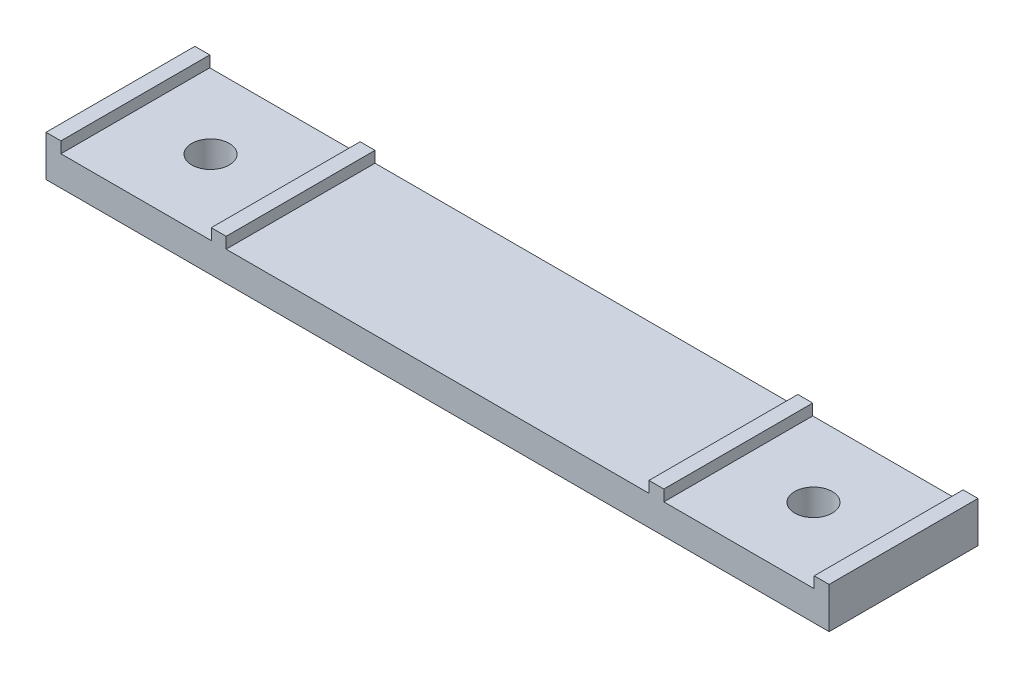
ISO-10303-21;
HEADER;
FILE_DESCRIPTION(('STEP AP214'),'2;1');
FILE_NAME('part.step','',(''),(''),'','','');
FILE_SCHEMA(('AUTOMOTIVE_DESIGN { 1 0 10303 214 1 1 1 1 }'));
ENDSEC;
DATA;
#1=APPLICATION_CONTEXT('core data for automotive mechanical design processes');
#2=APPLICATION_PROTOCOL_DEFINITION('international standard','automotive_design',2000,#1);
#3=PRODUCT_CONTEXT('',#1,'mechanical');
#4=PRODUCT('Part','Part','',(#3));
#5=PRODUCT_RELATED_PRODUCT_CATEGORY('part','',(#4));
#6=PRODUCT_DEFINITION_FORMATION('','',#4);
#7=PRODUCT_DEFINITION_CONTEXT('part definition',#1,'design');
#8=PRODUCT_DEFINITION('design','',#6,#7);
#9=PRODUCT_DEFINITION_SHAPE('','',#8);
#10=(LENGTH_UNIT() NAMED_UNIT(*) SI_UNIT(.MILLI.,.METRE.));
#11=(NAMED_UNIT(*) PLANE_ANGLE_UNIT() SI_UNIT($,.RADIAN.));
#12=(NAMED_UNIT(*) SI_UNIT($,.STERADIAN.) SOLID_ANGLE_UNIT());
#13=UNCERTAINTY_MEASURE_WITH_UNIT(LENGTH_MEASURE(1.E-05),#10,'distance_accuracy_value','');
#14=(GEOMETRIC_REPRESENTATION_CONTEXT(3) GLOBAL_UNCERTAINTY_ASSIGNED_CONTEXT((#13)) GLOBAL_UNIT_ASSIGNED_CONTEXT((#10,
#11,#12)) REPRESENTATION_CONTEXT('',''));
#15=CARTESIAN_POINT('',(0.,0.,0.));
#16=DIRECTION('',(0.,0.,1.));
#17=DIRECTION('',(1.,0.,0.));
#18=AXIS2_PLACEMENT_3D('',#15,#16,#17);
#19=CARTESIAN_POINT('',(-64.262,5.07999999999999,25.4));
#20=DIRECTION('',(0.,-1.,0.));
#21=DIRECTION('',(1.,0.,0.));
#22=AXIS2_PLACEMENT_3D('',#19,#20,#21);
#23=PLANE('',#22);
#24=CARTESIAN_POINT('',(-51.435,5.08,12.7));
#25=DIRECTION('',(0.,1.,0.));
#26=DIRECTION('',(0.,0.,1.));
#27=AXIS2_PLACEMENT_3D('',#24,#25,#26);
#28=CIRCLE('',#27,3.2004);
#29=CARTESIAN_POINT('',(-51.435,5.08,15.9004));
#30=VERTEX_POINT('',#29);
#31=EDGE_CURVE('E374',#30,#30,#28,.T.);
#32=ORIENTED_EDGE('',*,*,#31,.F.);
#33=EDGE_LOOP('',(#32));
#34=FACE_BOUND('',#33,.T.);
#35=DIRECTION('',(-1.,0.,0.));
#36=VECTOR('',#35,1.);
#37=CARTESIAN_POINT('',(-64.262,5.07999999999999,0.));
#38=LINE('',#37,#36);
#39=CARTESIAN_POINT('',(-38.608,5.08,0.));
#40=VERTEX_POINT('',#39);
#41=CARTESIAN_POINT('',(-64.262,5.07999999999999,0.));
#42=VERTEX_POINT('',#41);
#43=EDGE_CURVE('E193',#40,#42,#38,.T.);
#44=ORIENTED_EDGE('',*,*,#43,.T.);
#45=DIRECTION('',(0.,0.,-1.));
#46=VECTOR('',#45,1.);
#47=CARTESIAN_POINT('',(-64.262,5.07999999999999,25.4));
#48=LINE('',#47,#46);
#49=CARTESIAN_POINT('',(-64.262,5.07999999999999,25.4));
#50=VERTEX_POINT('',#49);
#51=EDGE_CURVE('E11',#50,#42,#48,.T.);
#52=ORIENTED_EDGE('',*,*,#51,.F.);
#53=DIRECTION('',(-1.,0.,0.));
#54=VECTOR('',#53,1.);
#55=CARTESIAN_POINT('',(-64.262,5.07999999999999,25.4));
#56=LINE('',#55,#54);
#57=CARTESIAN_POINT('',(-38.608,5.08,25.4));
#58=VERTEX_POINT('',#57);
#59=EDGE_CURVE('E242',#58,#50,#56,.T.);
#60=ORIENTED_EDGE('',*,*,#59,.F.);
#61=DIRECTION('',(0.,0.,-1.));
#62=VECTOR('',#61,1.);
#63=CARTESIAN_POINT('',(-38.608,5.08,25.4));
#64=LINE('',#63,#62);
#65=EDGE_CURVE('E192',#58,#40,#64,.T.);
#66=ORIENTED_EDGE('',*,*,#65,.T.);
#67=EDGE_LOOP('',(#44,#52,#60,#66));
#68=FACE_BOUND('',#67,.T.);
#69=ADVANCED_FACE('F44',(#34,#68),#23,.F.);
#70=CARTESIAN_POINT('',(-64.262,6.98499999999999,25.4));
#71=DIRECTION('',(-1.,0.,0.));
#72=DIRECTION('',(0.,0.,1.));
#73=AXIS2_PLACEMENT_3D('',#70,#71,#72);
#74=PLANE('',#73);
#75=DIRECTION('',(0.,1.,0.));
#76=VECTOR('',#75,1.);
#77=CARTESIAN_POINT('',(-64.262,6.98499999999999,0.));
#78=LINE('',#77,#76);
#79=CARTESIAN_POINT('',(-64.262,6.98499999999999,0.));
#80=VERTEX_POINT('',#79);
#81=EDGE_CURVE('E199',#42,#80,#78,.T.);
#82=ORIENTED_EDGE('',*,*,#81,.T.);
#83=DIRECTION('',(0.,0.,-1.));
#84=VECTOR('',#83,1.);
#85=CARTESIAN_POINT('',(-64.262,6.98499999999999,25.4));
#86=LINE('',#85,#84);
#87=CARTESIAN_POINT('',(-64.262,6.98499999999999,25.4));
#88=VERTEX_POINT('',#87);
#89=EDGE_CURVE('E54',#88,#80,#86,.T.);
#90=ORIENTED_EDGE('',*,*,#89,.F.);
#91=DIRECTION('',(0.,1.,0.));
#92=VECTOR('',#91,1.);
#93=CARTESIAN_POINT('',(-64.262,6.98499999999999,25.4));
#94=LINE('',#93,#92);
#95=EDGE_CURVE('E127',#50,#88,#94,.T.);
#96=ORIENTED_EDGE('',*,*,#95,.F.);
#97=ORIENTED_EDGE('',*,*,#51,.T.);
#98=EDGE_LOOP('',(#82,#90,#96,#97));
#99=FACE_BOUND('',#98,.T.);
#100=ADVANCED_FACE('F362',(#99),#74,.F.);
#101=CARTESIAN_POINT('',(-66.802,6.98499999999999,25.4));
#102=DIRECTION('',(0.,-1.,0.));
#103=DIRECTION('',(1.,0.,0.));
#104=AXIS2_PLACEMENT_3D('',#101,#102,#103);
#105=PLANE('',#104);
#106=DIRECTION('',(-1.,0.,0.));
#107=VECTOR('',#106,1.);
#108=CARTESIAN_POINT('',(-66.802,6.98499999999999,0.));
#109=LINE('',#108,#107);
#110=CARTESIAN_POINT('',(-66.802,6.98499999999999,0.));
#111=VERTEX_POINT('',#110);
#112=EDGE_CURVE('E205',#80,#111,#109,.T.);
#113=ORIENTED_EDGE('',*,*,#112,.T.);
#114=DIRECTION('',(0.,0.,-1.));
#115=VECTOR('',#114,1.);
#116=CARTESIAN_POINT('',(-66.802,6.98499999999999,25.4));
#117=LINE('',#116,#115);
#118=CARTESIAN_POINT('',(-66.802,6.98499999999999,25.4));
#119=VERTEX_POINT('',#118);
#120=EDGE_CURVE('E281',#119,#111,#117,.T.);
#121=ORIENTED_EDGE('',*,*,#120,.F.);
#122=DIRECTION('',(-1.,0.,0.));
#123=VECTOR('',#122,1.);
#124=CARTESIAN_POINT('',(-66.802,6.98499999999999,25.4));
#125=LINE('',#124,#123);
#126=EDGE_CURVE('E293',#88,#119,#125,.T.);
#127=ORIENTED_EDGE('',*,*,#126,.F.);
#128=ORIENTED_EDGE('',*,*,#89,.T.);
#129=EDGE_LOOP('',(#113,#121,#127,#128));
#130=FACE_BOUND('',#129,.T.);
#131=ADVANCED_FACE('F291',(#130),#105,.F.);
#132=CARTESIAN_POINT('',(-66.802,0.,25.4));
#133=DIRECTION('',(1.,0.,0.));
#134=DIRECTION('',(0.,0.,-1.));
#135=AXIS2_PLACEMENT_3D('',#132,#133,#134);
#136=PLANE('',#135);
#137=DIRECTION('',(0.,-1.,0.));
#138=VECTOR('',#137,1.);
#139=CARTESIAN_POINT('',(-66.802,0.,0.));
#140=LINE('',#139,#138);
#141=CARTESIAN_POINT('',(-66.802,0.,0.));
#142=VERTEX_POINT('',#141);
#143=EDGE_CURVE('E203',#111,#142,#140,.T.);
#144=ORIENTED_EDGE('',*,*,#143,.T.);
#145=DIRECTION('',(0.,0.,-1.));
#146=VECTOR('',#145,1.);
#147=CARTESIAN_POINT('',(-66.802,0.,25.4));
#148=LINE('',#147,#146);
#149=CARTESIAN_POINT('',(-66.802,0.,25.4));
#150=VERTEX_POINT('',#149);
#151=EDGE_CURVE('E279',#150,#142,#148,.T.);
#152=ORIENTED_EDGE('',*,*,#151,.F.);
#153=DIRECTION('',(0.,-1.,0.));
#154=VECTOR('',#153,1.);
#155=CARTESIAN_POINT('',(-66.802,0.,25.4));
#156=LINE('',#155,#154);
#157=EDGE_CURVE('E312',#119,#150,#156,.T.);
#158=ORIENTED_EDGE('',*,*,#157,.F.);
#159=ORIENTED_EDGE('',*,*,#120,.T.);
#160=EDGE_LOOP('',(#144,#152,#158,#159));
#161=FACE_BOUND('',#160,.T.);
#162=ADVANCED_FACE('F305',(#161),#136,.F.);
#163=CARTESIAN_POINT('',(66.802,0.,25.4));
#164=DIRECTION('',(0.,1.,0.));
#165=DIRECTION('',(0.,0.,1.));
#166=AXIS2_PLACEMENT_3D('',#163,#164,#165);
#167=PLANE('',#166);
#168=CARTESIAN_POINT('',(-51.435,0.,12.7));
#169=DIRECTION('',(0.,1.,0.));
#170=DIRECTION('',(0.,0.,1.));
#171=AXIS2_PLACEMENT_3D('',#168,#169,#170);
#172=CIRCLE('',#171,3.2004);
#173=CARTESIAN_POINT('',(-51.435,0.,15.9004));
#174=VERTEX_POINT('',#173);
#175=EDGE_CURVE('E48',#174,#174,#172,.T.);
#176=ORIENTED_EDGE('',*,*,#175,.T.);
#177=EDGE_LOOP('',(#176));
#178=FACE_BOUND('',#177,.T.);
#179=CARTESIAN_POINT('',(51.435,0.,12.7));
#180=DIRECTION('',(0.,1.,0.));
#181=DIRECTION('',(0.,0.,1.));
#182=AXIS2_PLACEMENT_3D('',#179,#180,#181);
#183=CIRCLE('',#182,3.2004);
#184=CARTESIAN_POINT('',(51.435,0.,15.9004));
#185=VERTEX_POINT('',#184);
#186=EDGE_CURVE('E377',#185,#185,#183,.T.);
#187=ORIENTED_EDGE('',*,*,#186,.T.);
#188=EDGE_LOOP('',(#187));
#189=FACE_BOUND('',#188,.T.);
#190=DIRECTION('',(1.,0.,0.));
#191=VECTOR('',#190,1.);
#192=CARTESIAN_POINT('',(66.802,0.,0.));
#193=LINE('',#192,#191);
#194=CARTESIAN_POINT('',(66.802,0.,0.));
#195=VERTEX_POINT('',#194);
#196=EDGE_CURVE('E208',#142,#195,#193,.T.);
#197=ORIENTED_EDGE('',*,*,#196,.T.);
#198=DIRECTION('',(0.,0.,-1.));
#199=VECTOR('',#198,1.);
#200=CARTESIAN_POINT('',(66.802,0.,25.4));
#201=LINE('',#200,#199);
#202=CARTESIAN_POINT('',(66.802,0.,25.4));
#203=VERTEX_POINT('',#202);
#204=EDGE_CURVE('E276',#203,#195,#201,.T.);
#205=ORIENTED_EDGE('',*,*,#204,.F.);
#206=DIRECTION('',(1.,0.,0.));
#207=VECTOR('',#206,1.);
#208=CARTESIAN_POINT('',(66.802,0.,25.4));
#209=LINE('',#208,#207);
#210=EDGE_CURVE('E307',#150,#203,#209,.T.);
#211=ORIENTED_EDGE('',*,*,#210,.F.);
#212=ORIENTED_EDGE('',*,*,#151,.T.);
#213=EDGE_LOOP('',(#197,#205,#211,#212));
#214=FACE_BOUND('',#213,.T.);
#215=ADVANCED_FACE('F306',(#178,#189,#214),#167,.F.);
#216=CARTESIAN_POINT('',(66.802,0.,25.4));
#217=DIRECTION('',(-1.,0.,0.));
#218=DIRECTION('',(0.,0.,1.));
#219=AXIS2_PLACEMENT_3D('',#216,#217,#218);
#220=PLANE('',#219);
#221=DIRECTION('',(0.,1.,0.));
#222=VECTOR('',#221,1.);
#223=CARTESIAN_POINT('',(66.802,0.,0.));
#224=LINE('',#223,#222);
#225=CARTESIAN_POINT('',(66.802,6.98499999999999,0.));
#226=VERTEX_POINT('',#225);
#227=EDGE_CURVE('E213',#195,#226,#224,.T.);
#228=ORIENTED_EDGE('',*,*,#227,.T.);
#229=DIRECTION('',(0.,0.,-1.));
#230=VECTOR('',#229,1.);
#231=CARTESIAN_POINT('',(66.802,6.98499999999999,25.4));
#232=LINE('',#231,#230);
#233=CARTESIAN_POINT('',(66.802,6.98499999999999,25.4));
#234=VERTEX_POINT('',#233);
#235=EDGE_CURVE('E275',#234,#226,#232,.T.);
#236=ORIENTED_EDGE('',*,*,#235,.F.);
#237=DIRECTION('',(0.,1.,0.));
#238=VECTOR('',#237,1.);
#239=CARTESIAN_POINT('',(66.802,0.,25.4));
#240=LINE('',#239,#238);
#241=EDGE_CURVE('E313',#203,#234,#240,.T.);
#242=ORIENTED_EDGE('',*,*,#241,.F.);
#243=ORIENTED_EDGE('',*,*,#204,.T.);
#244=EDGE_LOOP('',(#228,#236,#242,#243));
#245=FACE_BOUND('',#244,.T.);
#246=ADVANCED_FACE('F498',(#245),#220,.F.);
#247=CARTESIAN_POINT('',(66.802,6.98499999999999,25.4));
#248=DIRECTION('',(0.,-1.,0.));
#249=DIRECTION('',(1.,0.,0.));
#250=AXIS2_PLACEMENT_3D('',#247,#248,#249);
#251=PLANE('',#250);
#252=DIRECTION('',(-1.,0.,0.));
#253=VECTOR('',#252,1.);
#254=CARTESIAN_POINT('',(66.802,6.98499999999999,0.));
#255=LINE('',#254,#253);
#256=CARTESIAN_POINT('',(64.262,6.98499999999999,0.));
#257=VERTEX_POINT('',#256);
#258=EDGE_CURVE('E215',#226,#257,#255,.T.);
#259=ORIENTED_EDGE('',*,*,#258,.T.);
#260=DIRECTION('',(0.,0.,-1.));
#261=VECTOR('',#260,1.);
#262=CARTESIAN_POINT('',(64.262,6.98499999999999,25.4));
#263=LINE('',#262,#261);
#264=CARTESIAN_POINT('',(64.262,6.98499999999999,25.4));
#265=VERTEX_POINT('',#264);
#266=EDGE_CURVE('E268',#265,#257,#263,.T.);
#267=ORIENTED_EDGE('',*,*,#266,.F.);
#268=DIRECTION('',(-1.,0.,0.));
#269=VECTOR('',#268,1.);
#270=CARTESIAN_POINT('',(66.802,6.98499999999999,25.4));
#271=LINE('',#270,#269);
#272=EDGE_CURVE('E318',#234,#265,#271,.T.);
#273=ORIENTED_EDGE('',*,*,#272,.F.);
#274=ORIENTED_EDGE('',*,*,#235,.T.);
#275=EDGE_LOOP('',(#259,#267,#273,#274));
#276=FACE_BOUND('',#275,.T.);
#277=ADVANCED_FACE('F486',(#276),#251,.F.);
#278=CARTESIAN_POINT('',(64.262,6.98499999999999,25.4));
#279=DIRECTION('',(1.,0.,0.));
#280=DIRECTION('',(0.,0.,-1.));
#281=AXIS2_PLACEMENT_3D('',#278,#279,#280);
#282=PLANE('',#281);
#283=DIRECTION('',(0.,-1.,0.));
#284=VECTOR('',#283,1.);
#285=CARTESIAN_POINT('',(64.262,6.98499999999999,0.));
#286=LINE('',#285,#284);
#287=CARTESIAN_POINT('',(64.262,5.07999999999999,0.));
#288=VERTEX_POINT('',#287);
#289=EDGE_CURVE('E220',#257,#288,#286,.T.);
#290=ORIENTED_EDGE('',*,*,#289,.T.);
#291=DIRECTION('',(0.,0.,-1.));
#292=VECTOR('',#291,1.);
#293=CARTESIAN_POINT('',(64.262,5.07999999999999,25.4));
#294=LINE('',#293,#292);
#295=CARTESIAN_POINT('',(64.262,5.07999999999999,25.4));
#296=VERTEX_POINT('',#295);
#297=EDGE_CURVE('E264',#296,#288,#294,.T.);
#298=ORIENTED_EDGE('',*,*,#297,.F.);
#299=DIRECTION('',(0.,-1.,0.));
#300=VECTOR('',#299,1.);
#301=CARTESIAN_POINT('',(64.262,6.98499999999999,25.4));
#302=LINE('',#301,#300);
#303=EDGE_CURVE('E324',#265,#296,#302,.T.);
#304=ORIENTED_EDGE('',*,*,#303,.F.);
#305=ORIENTED_EDGE('',*,*,#266,.T.);
#306=EDGE_LOOP('',(#290,#298,#304,#305));
#307=FACE_BOUND('',#306,.T.);
#308=ADVANCED_FACE('F479',(#307),#282,.F.);
#309=CARTESIAN_POINT('',(64.262,5.07999999999999,25.4));
#310=DIRECTION('',(0.,-1.,0.));
#311=DIRECTION('',(1.,0.,0.));
#312=AXIS2_PLACEMENT_3D('',#309,#310,#311);
#313=PLANE('',#312);
#314=CARTESIAN_POINT('',(51.435,5.08,12.7));
#315=DIRECTION('',(0.,1.,0.));
#316=DIRECTION('',(0.,0.,1.));
#317=AXIS2_PLACEMENT_3D('',#314,#315,#316);
#318=CIRCLE('',#317,3.2004);
#319=CARTESIAN_POINT('',(51.435,5.08,15.9004));
#320=VERTEX_POINT('',#319);
#321=EDGE_CURVE('E380',#320,#320,#318,.T.);
#322=ORIENTED_EDGE('',*,*,#321,.F.);
#323=EDGE_LOOP('',(#322));
#324=FACE_BOUND('',#323,.T.);
#325=DIRECTION('',(-1.,0.,0.));
#326=VECTOR('',#325,1.);
#327=CARTESIAN_POINT('',(64.262,5.07999999999999,0.));
#328=LINE('',#327,#326);
#329=CARTESIAN_POINT('',(38.608,5.08,0.));
#330=VERTEX_POINT('',#329);
#331=EDGE_CURVE('E217',#288,#330,#328,.T.);
#332=ORIENTED_EDGE('',*,*,#331,.T.);
#333=DIRECTION('',(0.,0.,-1.));
#334=VECTOR('',#333,1.);
#335=CARTESIAN_POINT('',(38.608,5.08,25.4));
#336=LINE('',#335,#334);
#337=CARTESIAN_POINT('',(38.608,5.08,25.4));
#338=VERTEX_POINT('',#337);
#339=EDGE_CURVE('E259',#338,#330,#336,.T.);
#340=ORIENTED_EDGE('',*,*,#339,.F.);
#341=DIRECTION('',(-1.,0.,0.));
#342=VECTOR('',#341,1.);
#343=CARTESIAN_POINT('',(64.262,5.07999999999999,25.4));
#344=LINE('',#343,#342);
#345=EDGE_CURVE('E329',#296,#338,#344,.T.);
#346=ORIENTED_EDGE('',*,*,#345,.F.);
#347=ORIENTED_EDGE('',*,*,#297,.T.);
#348=EDGE_LOOP('',(#332,#340,#346,#347));
#349=FACE_BOUND('',#348,.T.);
#350=ADVANCED_FACE('F468',(#324,#349),#313,.F.);
#351=CARTESIAN_POINT('',(38.608,5.08,25.4));
#352=DIRECTION('',(-1.,0.,0.));
#353=DIRECTION('',(0.,-1.,0.));
#354=AXIS2_PLACEMENT_3D('',#351,#352,#353);
#355=PLANE('',#354);
#356=DIRECTION('',(0.,1.,0.));
#357=VECTOR('',#356,1.);
#358=CARTESIAN_POINT('',(38.608,5.08,0.));
#359=LINE('',#358,#357);
#360=CARTESIAN_POINT('',(38.608,6.985,0.));
#361=VERTEX_POINT('',#360);
#362=EDGE_CURVE('E223',#330,#361,#359,.T.);
#363=ORIENTED_EDGE('',*,*,#362,.T.);
#364=DIRECTION('',(0.,0.,-1.));
#365=VECTOR('',#364,1.);
#366=CARTESIAN_POINT('',(38.608,6.985,25.4));
#367=LINE('',#366,#365);
#368=CARTESIAN_POINT('',(38.608,6.985,25.4));
#369=VERTEX_POINT('',#368);
#370=EDGE_CURVE('E258',#369,#361,#367,.T.);
#371=ORIENTED_EDGE('',*,*,#370,.F.);
#372=DIRECTION('',(0.,1.,0.));
#373=VECTOR('',#372,1.);
#374=CARTESIAN_POINT('',(38.608,5.08,25.4));
#375=LINE('',#374,#373);
#376=EDGE_CURVE('E332',#338,#369,#375,.T.);
#377=ORIENTED_EDGE('',*,*,#376,.F.);
#378=ORIENTED_EDGE('',*,*,#339,.T.);
#379=EDGE_LOOP('',(#363,#371,#377,#378));
#380=FACE_BOUND('',#379,.T.);
#381=ADVANCED_FACE('F457',(#380),#355,.F.);
#382=CARTESIAN_POINT('',(38.608,6.985,25.4));
#383=DIRECTION('',(0.,-1.,0.));
#384=DIRECTION('',(1.,0.,0.));
#385=AXIS2_PLACEMENT_3D('',#382,#383,#384);
#386=PLANE('',#385);
#387=DIRECTION('',(-1.,0.,0.));
#388=VECTOR('',#387,1.);
#389=CARTESIAN_POINT('',(38.608,6.985,0.));
#390=LINE('',#389,#388);
#391=CARTESIAN_POINT('',(36.068,6.985,0.));
#392=VERTEX_POINT('',#391);
#393=EDGE_CURVE('E226',#361,#392,#390,.T.);
#394=ORIENTED_EDGE('',*,*,#393,.T.);
#395=DIRECTION('',(0.,0.,-1.));
#396=VECTOR('',#395,1.);
#397=CARTESIAN_POINT('',(36.068,6.985,25.4));
#398=LINE('',#397,#396);
#399=CARTESIAN_POINT('',(36.068,6.985,25.4));
#400=VERTEX_POINT('',#399);
#401=EDGE_CURVE('E255',#400,#392,#398,.T.);
#402=ORIENTED_EDGE('',*,*,#401,.F.);
#403=DIRECTION('',(-1.,0.,0.));
#404=VECTOR('',#403,1.);
#405=CARTESIAN_POINT('',(38.608,6.985,25.4));
#406=LINE('',#405,#404);
#407=EDGE_CURVE('E334',#369,#400,#406,.T.);
#408=ORIENTED_EDGE('',*,*,#407,.F.);
#409=ORIENTED_EDGE('',*,*,#370,.T.);
#410=EDGE_LOOP('',(#394,#402,#408,#409));
#411=FACE_BOUND('',#410,.T.);
#412=ADVANCED_FACE('F447',(#411),#386,.F.);
#413=CARTESIAN_POINT('',(36.068,6.985,25.4));
#414=DIRECTION('',(1.,0.,0.));
#415=DIRECTION('',(0.,0.,-1.));
#416=AXIS2_PLACEMENT_3D('',#413,#414,#415);
#417=PLANE('',#416);
#418=DIRECTION('',(0.,-1.,0.));
#419=VECTOR('',#418,1.);
#420=CARTESIAN_POINT('',(36.068,6.985,0.));
#421=LINE('',#420,#419);
#422=CARTESIAN_POINT('',(36.068,5.08,0.));
#423=VERTEX_POINT('',#422);
#424=EDGE_CURVE('E227',#392,#423,#421,.T.);
#425=ORIENTED_EDGE('',*,*,#424,.T.);
#426=DIRECTION('',(0.,0.,-1.));
#427=VECTOR('',#426,1.);
#428=CARTESIAN_POINT('',(36.068,5.08,25.4));
#429=LINE('',#428,#427);
#430=CARTESIAN_POINT('',(36.068,5.08,25.4));
#431=VERTEX_POINT('',#430);
#432=EDGE_CURVE('E246',#431,#423,#429,.T.);
#433=ORIENTED_EDGE('',*,*,#432,.F.);
#434=DIRECTION('',(0.,-1.,0.));
#435=VECTOR('',#434,1.);
#436=CARTESIAN_POINT('',(36.068,6.985,25.4));
#437=LINE('',#436,#435);
#438=EDGE_CURVE('E340',#400,#431,#437,.T.);
#439=ORIENTED_EDGE('',*,*,#438,.F.);
#440=ORIENTED_EDGE('',*,*,#401,.T.);
#441=EDGE_LOOP('',(#425,#433,#439,#440));
#442=FACE_BOUND('',#441,.T.);
#443=ADVANCED_FACE('F341',(#442),#417,.F.);
#444=CARTESIAN_POINT('',(-36.068,5.08,25.4));
#445=DIRECTION('',(0.,-1.,0.));
#446=DIRECTION('',(0.,0.,-1.));
#447=AXIS2_PLACEMENT_3D('',#444,#445,#446);
#448=PLANE('',#447);
#449=DIRECTION('',(-1.,0.,0.));
#450=VECTOR('',#449,1.);
#451=CARTESIAN_POINT('',(-36.068,5.08,0.));
#452=LINE('',#451,#450);
#453=CARTESIAN_POINT('',(-36.068,5.08,0.));
#454=VERTEX_POINT('',#453);
#455=EDGE_CURVE('E235',#423,#454,#452,.T.);
#456=ORIENTED_EDGE('',*,*,#455,.T.);
#457=DIRECTION('',(0.,0.,-1.));
#458=VECTOR('',#457,1.);
#459=CARTESIAN_POINT('',(-36.068,5.08,25.4));
#460=LINE('',#459,#458);
#461=CARTESIAN_POINT('',(-36.068,5.08,25.4));
#462=VERTEX_POINT('',#461);
#463=EDGE_CURVE('E182',#462,#454,#460,.T.);
#464=ORIENTED_EDGE('',*,*,#463,.F.);
#465=DIRECTION('',(-1.,0.,0.));
#466=VECTOR('',#465,1.);
#467=CARTESIAN_POINT('',(-36.068,5.08,25.4));
#468=LINE('',#467,#466);
#469=EDGE_CURVE('E171',#431,#462,#468,.T.);
#470=ORIENTED_EDGE('',*,*,#469,.F.);
#471=ORIENTED_EDGE('',*,*,#432,.T.);
#472=EDGE_LOOP('',(#456,#464,#470,#471));
#473=FACE_BOUND('',#472,.T.);
#474=ADVANCED_FACE('F350',(#473),#448,.F.);
#475=CARTESIAN_POINT('',(-36.068,6.985,25.4));
#476=DIRECTION('',(-1.,0.,0.));
#477=DIRECTION('',(0.,0.,1.));
#478=AXIS2_PLACEMENT_3D('',#475,#476,#477);
#479=PLANE('',#478);
#480=DIRECTION('',(0.,1.,0.));
#481=VECTOR('',#480,1.);
#482=CARTESIAN_POINT('',(-36.068,6.985,0.));
#483=LINE('',#482,#481);
#484=CARTESIAN_POINT('',(-36.068,6.985,0.));
#485=VERTEX_POINT('',#484);
#486=EDGE_CURVE('E185',#454,#485,#483,.T.);
#487=ORIENTED_EDGE('',*,*,#486,.T.);
#488=DIRECTION('',(0.,0.,-1.));
#489=VECTOR('',#488,1.);
#490=CARTESIAN_POINT('',(-36.068,6.985,25.4));
#491=LINE('',#490,#489);
#492=CARTESIAN_POINT('',(-36.068,6.985,25.4));
#493=VERTEX_POINT('',#492);
#494=EDGE_CURVE('E177',#493,#485,#491,.T.);
#495=ORIENTED_EDGE('',*,*,#494,.F.);
#496=DIRECTION('',(0.,1.,0.));
#497=VECTOR('',#496,1.);
#498=CARTESIAN_POINT('',(-36.068,6.985,25.4));
#499=LINE('',#498,#497);
#500=EDGE_CURVE('E167',#462,#493,#499,.T.);
#501=ORIENTED_EDGE('',*,*,#500,.F.);
#502=ORIENTED_EDGE('',*,*,#463,.T.);
#503=EDGE_LOOP('',(#487,#495,#501,#502));
#504=FACE_BOUND('',#503,.T.);
#505=ADVANCED_FACE('F179',(#504),#479,.F.);
#506=CARTESIAN_POINT('',(-38.608,6.985,25.4));
#507=DIRECTION('',(0.,-1.,0.));
#508=DIRECTION('',(1.,0.,0.));
#509=AXIS2_PLACEMENT_3D('',#506,#507,#508);
#510=PLANE('',#509);
#511=DIRECTION('',(-1.,0.,0.));
#512=VECTOR('',#511,1.);
#513=CARTESIAN_POINT('',(-38.608,6.985,0.));
#514=LINE('',#513,#512);
#515=CARTESIAN_POINT('',(-38.608,6.985,0.));
#516=VERTEX_POINT('',#515);
#517=EDGE_CURVE('E117',#485,#516,#514,.T.);
#518=ORIENTED_EDGE('',*,*,#517,.T.);
#519=DIRECTION('',(0.,0.,-1.));
#520=VECTOR('',#519,1.);
#521=CARTESIAN_POINT('',(-38.608,6.985,25.4));
#522=LINE('',#521,#520);
#523=CARTESIAN_POINT('',(-38.608,6.985,25.4));
#524=VERTEX_POINT('',#523);
#525=EDGE_CURVE('E184',#524,#516,#522,.T.);
#526=ORIENTED_EDGE('',*,*,#525,.F.);
#527=DIRECTION('',(-1.,0.,0.));
#528=VECTOR('',#527,1.);
#529=CARTESIAN_POINT('',(-38.608,6.985,25.4));
#530=LINE('',#529,#528);
#531=EDGE_CURVE('E173',#493,#524,#530,.T.);
#532=ORIENTED_EDGE('',*,*,#531,.F.);
#533=ORIENTED_EDGE('',*,*,#494,.T.);
#534=EDGE_LOOP('',(#518,#526,#532,#533));
#535=FACE_BOUND('',#534,.T.);
#536=ADVANCED_FACE('F190',(#535),#510,.F.);
#537=CARTESIAN_POINT('',(-38.608,5.08,25.4));
#538=DIRECTION('',(1.,0.,0.));
#539=DIRECTION('',(0.,1.,0.));
#540=AXIS2_PLACEMENT_3D('',#537,#538,#539);
#541=PLANE('',#540);
#542=DIRECTION('',(0.,-1.,0.));
#543=VECTOR('',#542,1.);
#544=CARTESIAN_POINT('',(-38.608,5.08,0.));
#545=LINE('',#544,#543);
#546=EDGE_CURVE('E122',#516,#40,#545,.T.);
#547=ORIENTED_EDGE('',*,*,#546,.T.);
#548=ORIENTED_EDGE('',*,*,#65,.F.);
#549=DIRECTION('',(0.,-1.,0.));
#550=VECTOR('',#549,1.);
#551=CARTESIAN_POINT('',(-38.608,5.08,25.4));
#552=LINE('',#551,#550);
#553=EDGE_CURVE('E63',#524,#58,#552,.T.);
#554=ORIENTED_EDGE('',*,*,#553,.F.);
#555=ORIENTED_EDGE('',*,*,#525,.T.);
#556=EDGE_LOOP('',(#547,#548,#554,#555));
#557=FACE_BOUND('',#556,.T.);
#558=ADVANCED_FACE('F351',(#557),#541,.F.);
#559=CARTESIAN_POINT('',(0.,0.,25.4));
#560=DIRECTION('',(0.,0.,1.));
#561=DIRECTION('',(1.,0.,0.));
#562=AXIS2_PLACEMENT_3D('',#559,#560,#561);
#563=PLANE('',#562);
#564=ORIENTED_EDGE('',*,*,#59,.T.);
#565=ORIENTED_EDGE('',*,*,#95,.T.);
#566=ORIENTED_EDGE('',*,*,#126,.T.);
#567=ORIENTED_EDGE('',*,*,#157,.T.);
#568=ORIENTED_EDGE('',*,*,#210,.T.);
#569=ORIENTED_EDGE('',*,*,#241,.T.);
#570=ORIENTED_EDGE('',*,*,#272,.T.);
#571=ORIENTED_EDGE('',*,*,#303,.T.);
#572=ORIENTED_EDGE('',*,*,#345,.T.);
#573=ORIENTED_EDGE('',*,*,#376,.T.);
#574=ORIENTED_EDGE('',*,*,#407,.T.);
#575=ORIENTED_EDGE('',*,*,#438,.T.);
#576=ORIENTED_EDGE('',*,*,#469,.T.);
#577=ORIENTED_EDGE('',*,*,#500,.T.);
#578=ORIENTED_EDGE('',*,*,#531,.T.);
#579=ORIENTED_EDGE('',*,*,#553,.T.);
#580=EDGE_LOOP('',(#564,#565,#566,#567,#568,#569,#570,#571,#572,#573,#574,#575,#576,#577,#578,#579));
#581=FACE_BOUND('',#580,.T.);
#582=ADVANCED_FACE('F170',(#581),#563,.T.);
#583=CARTESIAN_POINT('',(0.,0.,0.));
#584=DIRECTION('',(0.,0.,1.));
#585=DIRECTION('',(1.,0.,0.));
#586=AXIS2_PLACEMENT_3D('',#583,#584,#585);
#587=PLANE('',#586);
#588=ORIENTED_EDGE('',*,*,#43,.F.);
#589=ORIENTED_EDGE('',*,*,#546,.F.);
#590=ORIENTED_EDGE('',*,*,#517,.F.);
#591=ORIENTED_EDGE('',*,*,#486,.F.);
#592=ORIENTED_EDGE('',*,*,#455,.F.);
#593=ORIENTED_EDGE('',*,*,#424,.F.);
#594=ORIENTED_EDGE('',*,*,#393,.F.);
#595=ORIENTED_EDGE('',*,*,#362,.F.);
#596=ORIENTED_EDGE('',*,*,#331,.F.);
#597=ORIENTED_EDGE('',*,*,#289,.F.);
#598=ORIENTED_EDGE('',*,*,#258,.F.);
#599=ORIENTED_EDGE('',*,*,#227,.F.);
#600=ORIENTED_EDGE('',*,*,#196,.F.);
#601=ORIENTED_EDGE('',*,*,#143,.F.);
#602=ORIENTED_EDGE('',*,*,#112,.F.);
#603=ORIENTED_EDGE('',*,*,#81,.F.);
#604=EDGE_LOOP('',(#588,#589,#590,#591,#592,#593,#594,#595,#596,#597,#598,#599,#600,#601,#602,#603));
#605=FACE_BOUND('',#604,.T.);
#606=ADVANCED_FACE('F299',(#605),#587,.F.);
#607=CARTESIAN_POINT('',(51.435,-20.32,12.7));
#608=DIRECTION('',(0.,1.,0.));
#609=DIRECTION('',(0.,0.,1.));
#610=AXIS2_PLACEMENT_3D('',#607,#608,#609);
#611=CYLINDRICAL_SURFACE('',#610,3.2004);
#612=ORIENTED_EDGE('',*,*,#321,.T.);
#613=EDGE_LOOP('',(#612));
#614=FACE_BOUND('',#613,.T.);
#615=ORIENTED_EDGE('',*,*,#186,.F.);
#616=EDGE_LOOP('',(#615));
#617=FACE_BOUND('',#616,.T.);
#618=ADVANCED_FACE('F396',(#614,#617),#611,.F.);
#619=CARTESIAN_POINT('',(-51.435,-20.32,12.7));
#620=DIRECTION('',(0.,1.,0.));
#621=DIRECTION('',(0.,0.,1.));
#622=AXIS2_PLACEMENT_3D('',#619,#620,#621);
#623=CYLINDRICAL_SURFACE('',#622,3.2004);
#624=ORIENTED_EDGE('',*,*,#31,.T.);
#625=EDGE_LOOP('',(#624));
#626=FACE_BOUND('',#625,.T.);
#627=ORIENTED_EDGE('',*,*,#175,.F.);
#628=EDGE_LOOP('',(#627));
#629=FACE_BOUND('',#628,.T.);
#630=ADVANCED_FACE('F398',(#626,#629),#623,.F.);
#631=CLOSED_SHELL('',(#69,#100,#131,#162,#215,#246,#277,#308,#350,#381,#412,#443,#474,#505,#536,
#558,#582,#606,#618,#630));
#632=MANIFOLD_SOLID_BREP('B2',#631);
#633=ADVANCED_BREP_SHAPE_REPRESENTATION('',(#18,#632),#14);
#634=SHAPE_DEFINITION_REPRESENTATION(#9,#633);
ENDSEC;
END-ISO-10303-21;
